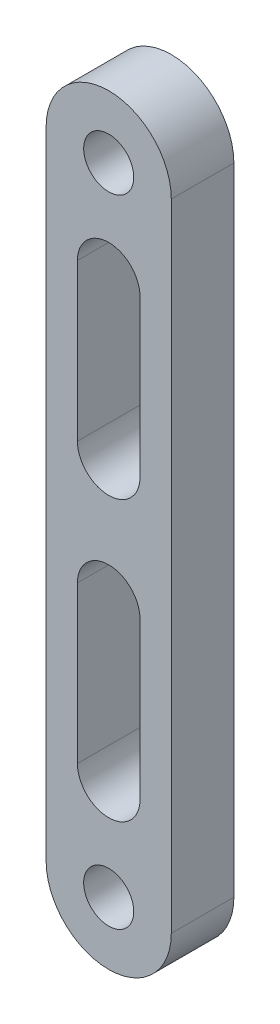
ISO-10303-21;
HEADER;
FILE_DESCRIPTION(('STEP AP214'),'2;1');
FILE_NAME('part.step','',(''),(''),'','','');
FILE_SCHEMA(('AUTOMOTIVE_DESIGN { 1 0 10303 214 1 1 1 1 }'));
ENDSEC;
DATA;
#1=APPLICATION_CONTEXT('core data for automotive mechanical design processes');
#2=APPLICATION_PROTOCOL_DEFINITION('international standard','automotive_design',2000,#1);
#3=PRODUCT_CONTEXT('',#1,'mechanical');
#4=PRODUCT('Part','Part','',(#3));
#5=PRODUCT_RELATED_PRODUCT_CATEGORY('part','',(#4));
#6=PRODUCT_DEFINITION_FORMATION('','',#4);
#7=PRODUCT_DEFINITION_CONTEXT('part definition',#1,'design');
#8=PRODUCT_DEFINITION('design','',#6,#7);
#9=PRODUCT_DEFINITION_SHAPE('','',#8);
#10=(LENGTH_UNIT() NAMED_UNIT(*) SI_UNIT(.MILLI.,.METRE.));
#11=(NAMED_UNIT(*) PLANE_ANGLE_UNIT() SI_UNIT($,.RADIAN.));
#12=(NAMED_UNIT(*) SI_UNIT($,.STERADIAN.) SOLID_ANGLE_UNIT());
#13=UNCERTAINTY_MEASURE_WITH_UNIT(LENGTH_MEASURE(1.E-05),#10,'distance_accuracy_value','');
#14=(GEOMETRIC_REPRESENTATION_CONTEXT(3) GLOBAL_UNCERTAINTY_ASSIGNED_CONTEXT((#13)) GLOBAL_UNIT_ASSIGNED_CONTEXT((#10,
#11,#12)) REPRESENTATION_CONTEXT('',''));
#15=CARTESIAN_POINT('',(0.,0.,0.));
#16=DIRECTION('',(0.,0.,1.));
#17=DIRECTION('',(1.,0.,0.));
#18=AXIS2_PLACEMENT_3D('',#15,#16,#17);
#19=CARTESIAN_POINT('',(0.,-50.8,10.));
#20=DIRECTION('',(0.,0.,1.));
#21=DIRECTION('',(1.,0.,0.));
#22=AXIS2_PLACEMENT_3D('',#19,#20,#21);
#23=PLANE('',#22);
#24=CARTESIAN_POINT('',(0.,-50.8,10.));
#25=DIRECTION('',(0.,0.,1.));
#26=DIRECTION('',(1.,0.,0.));
#27=AXIS2_PLACEMENT_3D('',#24,#25,#26);
#28=CIRCLE('',#27,4.);
#29=CARTESIAN_POINT('',(4.00000000000001,-50.8,10.));
#30=VERTEX_POINT('',#29);
#31=EDGE_CURVE('E228',#30,#30,#28,.T.);
#32=ORIENTED_EDGE('',*,*,#31,.F.);
#33=EDGE_LOOP('',(#32));
#34=FACE_BOUND('',#33,.T.);
#35=CARTESIAN_POINT('',(0.,-50.8,10.));
#36=DIRECTION('',(0.,0.,1.));
#37=DIRECTION('',(1.,0.,0.));
#38=AXIS2_PLACEMENT_3D('',#35,#36,#37);
#39=CIRCLE('',#38,10.);
#40=CARTESIAN_POINT('',(-9.99999999999999,-50.8,10.));
#41=VERTEX_POINT('',#40);
#42=CARTESIAN_POINT('',(10.,-50.8,10.));
#43=VERTEX_POINT('',#42);
#44=EDGE_CURVE('E236',#41,#43,#39,.T.);
#45=ORIENTED_EDGE('',*,*,#44,.T.);
#46=DIRECTION('',(0.,1.,0.));
#47=VECTOR('',#46,1.);
#48=CARTESIAN_POINT('',(10.,-50.8,10.));
#49=LINE('',#48,#47);
#50=CARTESIAN_POINT('',(10.,50.8,10.));
#51=VERTEX_POINT('',#50);
#52=EDGE_CURVE('E240',#43,#51,#49,.T.);
#53=ORIENTED_EDGE('',*,*,#52,.T.);
#54=CARTESIAN_POINT('',(0.,50.8,10.));
#55=DIRECTION('',(0.,0.,1.));
#56=DIRECTION('',(1.,0.,0.));
#57=AXIS2_PLACEMENT_3D('',#54,#55,#56);
#58=CIRCLE('',#57,10.);
#59=CARTESIAN_POINT('',(-10.,50.8,10.));
#60=VERTEX_POINT('',#59);
#61=EDGE_CURVE('E244',#51,#60,#58,.T.);
#62=ORIENTED_EDGE('',*,*,#61,.T.);
#63=DIRECTION('',(0.,-1.,0.));
#64=VECTOR('',#63,1.);
#65=CARTESIAN_POINT('',(-9.99999999999999,-50.8,10.));
#66=LINE('',#65,#64);
#67=EDGE_CURVE('E247',#60,#41,#66,.T.);
#68=ORIENTED_EDGE('',*,*,#67,.T.);
#69=EDGE_LOOP('',(#45,#53,#62,#68));
#70=FACE_BOUND('',#69,.T.);
#71=CARTESIAN_POINT('',(0.,50.8,10.));
#72=DIRECTION('',(0.,0.,1.));
#73=DIRECTION('',(1.,0.,0.));
#74=AXIS2_PLACEMENT_3D('',#71,#72,#73);
#75=CIRCLE('',#74,4.);
#76=CARTESIAN_POINT('',(4.,50.8,10.));
#77=VERTEX_POINT('',#76);
#78=EDGE_CURVE('E220',#77,#77,#75,.T.);
#79=ORIENTED_EDGE('',*,*,#78,.F.);
#80=EDGE_LOOP('',(#79));
#81=FACE_BOUND('',#80,.T.);
#82=DIRECTION('',(0.,1.,0.));
#83=VECTOR('',#82,1.);
#84=CARTESIAN_POINT('',(5.00000000000001,-34.8,10.));
#85=LINE('',#84,#83);
#86=CARTESIAN_POINT('',(5.00000000000001,-34.8,10.));
#87=VERTEX_POINT('',#86);
#88=CARTESIAN_POINT('',(4.99999999999999,-9.79999999999998,10.));
#89=VERTEX_POINT('',#88);
#90=EDGE_CURVE('E180',#87,#89,#85,.T.);
#91=ORIENTED_EDGE('',*,*,#90,.F.);
#92=CARTESIAN_POINT('',(0.,-34.8,10.));
#93=DIRECTION('',(0.,0.,1.));
#94=DIRECTION('',(1.,0.,0.));
#95=AXIS2_PLACEMENT_3D('',#92,#93,#94);
#96=CIRCLE('',#95,5.);
#97=CARTESIAN_POINT('',(-4.99999999999999,-34.8,10.));
#98=VERTEX_POINT('',#97);
#99=EDGE_CURVE('E177',#98,#87,#96,.T.);
#100=ORIENTED_EDGE('',*,*,#99,.F.);
#101=DIRECTION('',(0.,-1.,0.));
#102=VECTOR('',#101,1.);
#103=CARTESIAN_POINT('',(-4.99999999999999,-34.8,10.));
#104=LINE('',#103,#102);
#105=CARTESIAN_POINT('',(-4.99999999999999,-9.79999999999998,10.));
#106=VERTEX_POINT('',#105);
#107=EDGE_CURVE('E188',#106,#98,#104,.T.);
#108=ORIENTED_EDGE('',*,*,#107,.F.);
#109=CARTESIAN_POINT('',(0.,-9.79999999999997,10.));
#110=DIRECTION('',(0.,0.,1.));
#111=DIRECTION('',(1.,0.,0.));
#112=AXIS2_PLACEMENT_3D('',#109,#110,#111);
#113=CIRCLE('',#112,5.);
#114=EDGE_CURVE('E184',#89,#106,#113,.T.);
#115=ORIENTED_EDGE('',*,*,#114,.F.);
#116=EDGE_LOOP('',(#91,#100,#108,#115));
#117=FACE_BOUND('',#116,.T.);
#118=DIRECTION('',(0.,-1.,0.));
#119=VECTOR('',#118,1.);
#120=CARTESIAN_POINT('',(-5.,34.8,10.));
#121=LINE('',#120,#119);
#122=CARTESIAN_POINT('',(-5.,34.8,10.));
#123=VERTEX_POINT('',#122);
#124=CARTESIAN_POINT('',(-5.,9.8,10.));
#125=VERTEX_POINT('',#124);
#126=EDGE_CURVE('E138',#123,#125,#121,.T.);
#127=ORIENTED_EDGE('',*,*,#126,.F.);
#128=CARTESIAN_POINT('',(0.,34.8,10.));
#129=DIRECTION('',(0.,0.,1.));
#130=DIRECTION('',(1.,0.,0.));
#131=AXIS2_PLACEMENT_3D('',#128,#129,#130);
#132=CIRCLE('',#131,5.00000000000002);
#133=CARTESIAN_POINT('',(5.00000000000004,34.8,10.));
#134=VERTEX_POINT('',#133);
#135=EDGE_CURVE('E129',#134,#123,#132,.T.);
#136=ORIENTED_EDGE('',*,*,#135,.F.);
#137=DIRECTION('',(0.,1.,0.));
#138=VECTOR('',#137,1.);
#139=CARTESIAN_POINT('',(5.00000000000004,34.8,10.));
#140=LINE('',#139,#138);
#141=CARTESIAN_POINT('',(5.00000000000001,9.8,10.));
#142=VERTEX_POINT('',#141);
#143=EDGE_CURVE('E155',#142,#134,#140,.T.);
#144=ORIENTED_EDGE('',*,*,#143,.F.);
#145=CARTESIAN_POINT('',(0.,9.8,10.));
#146=DIRECTION('',(0.,0.,1.));
#147=DIRECTION('',(1.,0.,0.));
#148=AXIS2_PLACEMENT_3D('',#145,#146,#147);
#149=CIRCLE('',#148,5.00000000000001);
#150=EDGE_CURVE('E151',#125,#142,#149,.T.);
#151=ORIENTED_EDGE('',*,*,#150,.F.);
#152=EDGE_LOOP('',(#127,#136,#144,#151));
#153=FACE_BOUND('',#152,.T.);
#154=ADVANCED_FACE('F39',(#34,#70,#81,#117,#153),#23,.T.);
#155=CARTESIAN_POINT('',(0.,-50.8,0.));
#156=DIRECTION('',(0.,0.,1.));
#157=DIRECTION('',(1.,0.,0.));
#158=AXIS2_PLACEMENT_3D('',#155,#156,#157);
#159=PLANE('',#158);
#160=CARTESIAN_POINT('',(0.,-34.8,0.));
#161=DIRECTION('',(0.,0.,1.));
#162=DIRECTION('',(1.,0.,0.));
#163=AXIS2_PLACEMENT_3D('',#160,#161,#162);
#164=CIRCLE('',#163,5.);
#165=CARTESIAN_POINT('',(-4.99999999999999,-34.8,0.));
#166=VERTEX_POINT('',#165);
#167=CARTESIAN_POINT('',(5.00000000000001,-34.8,0.));
#168=VERTEX_POINT('',#167);
#169=EDGE_CURVE('E147',#166,#168,#164,.T.);
#170=ORIENTED_EDGE('',*,*,#169,.T.);
#171=DIRECTION('',(0.,1.,0.));
#172=VECTOR('',#171,1.);
#173=CARTESIAN_POINT('',(5.00000000000001,-34.8,0.));
#174=LINE('',#173,#172);
#175=CARTESIAN_POINT('',(4.99999999999999,-9.79999999999998,0.));
#176=VERTEX_POINT('',#175);
#177=EDGE_CURVE('E195',#168,#176,#174,.T.);
#178=ORIENTED_EDGE('',*,*,#177,.T.);
#179=CARTESIAN_POINT('',(0.,-9.79999999999997,0.));
#180=DIRECTION('',(0.,0.,1.));
#181=DIRECTION('',(1.,0.,0.));
#182=AXIS2_PLACEMENT_3D('',#179,#180,#181);
#183=CIRCLE('',#182,5.);
#184=CARTESIAN_POINT('',(-4.99999999999999,-9.79999999999998,0.));
#185=VERTEX_POINT('',#184);
#186=EDGE_CURVE('E199',#176,#185,#183,.T.);
#187=ORIENTED_EDGE('',*,*,#186,.T.);
#188=DIRECTION('',(0.,-1.,0.));
#189=VECTOR('',#188,1.);
#190=CARTESIAN_POINT('',(-4.99999999999999,-34.8,0.));
#191=LINE('',#190,#189);
#192=EDGE_CURVE('E181',#185,#166,#191,.T.);
#193=ORIENTED_EDGE('',*,*,#192,.T.);
#194=EDGE_LOOP('',(#170,#178,#187,#193));
#195=FACE_BOUND('',#194,.T.);
#196=CARTESIAN_POINT('',(0.,-50.8,0.));
#197=DIRECTION('',(0.,0.,1.));
#198=DIRECTION('',(1.,0.,0.));
#199=AXIS2_PLACEMENT_3D('',#196,#197,#198);
#200=CIRCLE('',#199,10.);
#201=CARTESIAN_POINT('',(-9.99999999999999,-50.8,0.));
#202=VERTEX_POINT('',#201);
#203=CARTESIAN_POINT('',(10.,-50.8,0.));
#204=VERTEX_POINT('',#203);
#205=EDGE_CURVE('E232',#202,#204,#200,.T.);
#206=ORIENTED_EDGE('',*,*,#205,.F.);
#207=DIRECTION('',(0.,-1.,0.));
#208=VECTOR('',#207,1.);
#209=CARTESIAN_POINT('',(-9.99999999999999,-50.8,0.));
#210=LINE('',#209,#208);
#211=CARTESIAN_POINT('',(-10.,50.8,0.));
#212=VERTEX_POINT('',#211);
#213=EDGE_CURVE('E241',#212,#202,#210,.T.);
#214=ORIENTED_EDGE('',*,*,#213,.F.);
#215=CARTESIAN_POINT('',(0.,50.8,0.));
#216=DIRECTION('',(0.,0.,1.));
#217=DIRECTION('',(1.,0.,0.));
#218=AXIS2_PLACEMENT_3D('',#215,#216,#217);
#219=CIRCLE('',#218,10.);
#220=CARTESIAN_POINT('',(10.,50.8,0.));
#221=VERTEX_POINT('',#220);
#222=EDGE_CURVE('E257',#221,#212,#219,.T.);
#223=ORIENTED_EDGE('',*,*,#222,.F.);
#224=DIRECTION('',(0.,1.,0.));
#225=VECTOR('',#224,1.);
#226=CARTESIAN_POINT('',(10.,-50.8,0.));
#227=LINE('',#226,#225);
#228=EDGE_CURVE('E254',#204,#221,#227,.T.);
#229=ORIENTED_EDGE('',*,*,#228,.F.);
#230=EDGE_LOOP('',(#206,#214,#223,#229));
#231=FACE_BOUND('',#230,.T.);
#232=CARTESIAN_POINT('',(0.,-50.8,0.));
#233=DIRECTION('',(0.,0.,1.));
#234=DIRECTION('',(1.,0.,0.));
#235=AXIS2_PLACEMENT_3D('',#232,#233,#234);
#236=CIRCLE('',#235,4.);
#237=CARTESIAN_POINT('',(4.00000000000001,-50.8,0.));
#238=VERTEX_POINT('',#237);
#239=EDGE_CURVE('E224',#238,#238,#236,.T.);
#240=ORIENTED_EDGE('',*,*,#239,.T.);
#241=EDGE_LOOP('',(#240));
#242=FACE_BOUND('',#241,.T.);
#243=CARTESIAN_POINT('',(0.,50.8,0.));
#244=DIRECTION('',(0.,0.,1.));
#245=DIRECTION('',(1.,0.,0.));
#246=AXIS2_PLACEMENT_3D('',#243,#244,#245);
#247=CIRCLE('',#246,4.);
#248=CARTESIAN_POINT('',(4.,50.8,0.));
#249=VERTEX_POINT('',#248);
#250=EDGE_CURVE('E219',#249,#249,#247,.T.);
#251=ORIENTED_EDGE('',*,*,#250,.T.);
#252=EDGE_LOOP('',(#251));
#253=FACE_BOUND('',#252,.T.);
#254=CARTESIAN_POINT('',(0.,34.8,0.));
#255=DIRECTION('',(0.,0.,1.));
#256=DIRECTION('',(1.,0.,0.));
#257=AXIS2_PLACEMENT_3D('',#254,#255,#256);
#258=CIRCLE('',#257,5.00000000000002);
#259=CARTESIAN_POINT('',(5.00000000000004,34.8,0.));
#260=VERTEX_POINT('',#259);
#261=CARTESIAN_POINT('',(-5.,34.8,0.));
#262=VERTEX_POINT('',#261);
#263=EDGE_CURVE('E63',#260,#262,#258,.T.);
#264=ORIENTED_EDGE('',*,*,#263,.T.);
#265=DIRECTION('',(0.,-1.,0.));
#266=VECTOR('',#265,1.);
#267=CARTESIAN_POINT('',(-5.,34.8,0.));
#268=LINE('',#267,#266);
#269=CARTESIAN_POINT('',(-5.,9.8,0.));
#270=VERTEX_POINT('',#269);
#271=EDGE_CURVE('E145',#262,#270,#268,.T.);
#272=ORIENTED_EDGE('',*,*,#271,.T.);
#273=CARTESIAN_POINT('',(0.,9.8,0.));
#274=DIRECTION('',(0.,0.,1.));
#275=DIRECTION('',(1.,0.,0.));
#276=AXIS2_PLACEMENT_3D('',#273,#274,#275);
#277=CIRCLE('',#276,5.00000000000001);
#278=CARTESIAN_POINT('',(5.00000000000001,9.8,0.));
#279=VERTEX_POINT('',#278);
#280=EDGE_CURVE('E164',#270,#279,#277,.T.);
#281=ORIENTED_EDGE('',*,*,#280,.T.);
#282=DIRECTION('',(0.,1.,0.));
#283=VECTOR('',#282,1.);
#284=CARTESIAN_POINT('',(5.00000000000004,34.8,0.));
#285=LINE('',#284,#283);
#286=EDGE_CURVE('E139',#279,#260,#285,.T.);
#287=ORIENTED_EDGE('',*,*,#286,.T.);
#288=EDGE_LOOP('',(#264,#272,#281,#287));
#289=FACE_BOUND('',#288,.T.);
#290=ADVANCED_FACE('F280',(#195,#231,#242,#253,#289),#159,.F.);
#291=CARTESIAN_POINT('',(0.,-50.8,10.));
#292=DIRECTION('',(0.,0.,-1.));
#293=DIRECTION('',(-1.,0.,0.));
#294=AXIS2_PLACEMENT_3D('',#291,#292,#293);
#295=CYLINDRICAL_SURFACE('',#294,10.);
#296=ORIENTED_EDGE('',*,*,#205,.T.);
#297=DIRECTION('',(0.,0.,-1.));
#298=VECTOR('',#297,1.);
#299=CARTESIAN_POINT('',(10.,-50.8,10.));
#300=LINE('',#299,#298);
#301=EDGE_CURVE('E11',#43,#204,#300,.T.);
#302=ORIENTED_EDGE('',*,*,#301,.F.);
#303=ORIENTED_EDGE('',*,*,#44,.F.);
#304=DIRECTION('',(0.,0.,-1.));
#305=VECTOR('',#304,1.);
#306=CARTESIAN_POINT('',(-9.99999999999999,-50.8,10.));
#307=LINE('',#306,#305);
#308=EDGE_CURVE('E250',#41,#202,#307,.T.);
#309=ORIENTED_EDGE('',*,*,#308,.T.);
#310=EDGE_LOOP('',(#296,#302,#303,#309));
#311=FACE_BOUND('',#310,.T.);
#312=ADVANCED_FACE('F41',(#311),#295,.T.);
#313=CARTESIAN_POINT('',(10.,-50.8,10.));
#314=DIRECTION('',(-1.,0.,0.));
#315=DIRECTION('',(0.,-1.,0.));
#316=AXIS2_PLACEMENT_3D('',#313,#314,#315);
#317=PLANE('',#316);
#318=ORIENTED_EDGE('',*,*,#228,.T.);
#319=DIRECTION('',(0.,0.,-1.));
#320=VECTOR('',#319,1.);
#321=CARTESIAN_POINT('',(10.,50.8,10.));
#322=LINE('',#321,#320);
#323=EDGE_CURVE('E48',#51,#221,#322,.T.);
#324=ORIENTED_EDGE('',*,*,#323,.F.);
#325=ORIENTED_EDGE('',*,*,#52,.F.);
#326=ORIENTED_EDGE('',*,*,#301,.T.);
#327=EDGE_LOOP('',(#318,#324,#325,#326));
#328=FACE_BOUND('',#327,.T.);
#329=ADVANCED_FACE('F291',(#328),#317,.F.);
#330=CARTESIAN_POINT('',(0.,50.8,10.));
#331=DIRECTION('',(0.,0.,-1.));
#332=DIRECTION('',(-1.,0.,0.));
#333=AXIS2_PLACEMENT_3D('',#330,#331,#332);
#334=CYLINDRICAL_SURFACE('',#333,10.);
#335=ORIENTED_EDGE('',*,*,#222,.T.);
#336=DIRECTION('',(0.,0.,-1.));
#337=VECTOR('',#336,1.);
#338=CARTESIAN_POINT('',(-10.,50.8,10.));
#339=LINE('',#338,#337);
#340=EDGE_CURVE('E265',#60,#212,#339,.T.);
#341=ORIENTED_EDGE('',*,*,#340,.F.);
#342=ORIENTED_EDGE('',*,*,#61,.F.);
#343=ORIENTED_EDGE('',*,*,#323,.T.);
#344=EDGE_LOOP('',(#335,#341,#342,#343));
#345=FACE_BOUND('',#344,.T.);
#346=ADVANCED_FACE('F274',(#345),#334,.T.);
#347=CARTESIAN_POINT('',(-9.99999999999999,-50.8,10.));
#348=DIRECTION('',(1.,0.,0.));
#349=DIRECTION('',(0.,1.,0.));
#350=AXIS2_PLACEMENT_3D('',#347,#348,#349);
#351=PLANE('',#350);
#352=ORIENTED_EDGE('',*,*,#213,.T.);
#353=ORIENTED_EDGE('',*,*,#308,.F.);
#354=ORIENTED_EDGE('',*,*,#67,.F.);
#355=ORIENTED_EDGE('',*,*,#340,.T.);
#356=EDGE_LOOP('',(#352,#353,#354,#355));
#357=FACE_BOUND('',#356,.T.);
#358=ADVANCED_FACE('F284',(#357),#351,.F.);
#359=CARTESIAN_POINT('',(0.,-50.8,10.));
#360=DIRECTION('',(0.,0.,-1.));
#361=DIRECTION('',(-1.,0.,0.));
#362=AXIS2_PLACEMENT_3D('',#359,#360,#361);
#363=CYLINDRICAL_SURFACE('',#362,4.);
#364=ORIENTED_EDGE('',*,*,#31,.T.);
#365=EDGE_LOOP('',(#364));
#366=FACE_BOUND('',#365,.T.);
#367=ORIENTED_EDGE('',*,*,#239,.F.);
#368=EDGE_LOOP('',(#367));
#369=FACE_BOUND('',#368,.T.);
#370=ADVANCED_FACE('F308',(#366,#369),#363,.F.);
#371=CARTESIAN_POINT('',(0.,50.8,10.));
#372=DIRECTION('',(0.,0.,-1.));
#373=DIRECTION('',(-1.,0.,0.));
#374=AXIS2_PLACEMENT_3D('',#371,#372,#373);
#375=CYLINDRICAL_SURFACE('',#374,4.);
#376=ORIENTED_EDGE('',*,*,#78,.T.);
#377=EDGE_LOOP('',(#376));
#378=FACE_BOUND('',#377,.T.);
#379=ORIENTED_EDGE('',*,*,#250,.F.);
#380=EDGE_LOOP('',(#379));
#381=FACE_BOUND('',#380,.T.);
#382=ADVANCED_FACE('F315',(#378,#381),#375,.F.);
#383=CARTESIAN_POINT('',(0.,-34.8,10.));
#384=DIRECTION('',(0.,0.,-1.));
#385=DIRECTION('',(-1.,0.,0.));
#386=AXIS2_PLACEMENT_3D('',#383,#384,#385);
#387=CYLINDRICAL_SURFACE('',#386,5.);
#388=ORIENTED_EDGE('',*,*,#169,.F.);
#389=DIRECTION('',(0.,0.,-1.));
#390=VECTOR('',#389,1.);
#391=CARTESIAN_POINT('',(-4.99999999999999,-34.8,10.));
#392=LINE('',#391,#390);
#393=EDGE_CURVE('E191',#98,#166,#392,.T.);
#394=ORIENTED_EDGE('',*,*,#393,.F.);
#395=ORIENTED_EDGE('',*,*,#99,.T.);
#396=DIRECTION('',(0.,0.,-1.));
#397=VECTOR('',#396,1.);
#398=CARTESIAN_POINT('',(5.00000000000001,-34.8,10.));
#399=LINE('',#398,#397);
#400=EDGE_CURVE('E215',#87,#168,#399,.T.);
#401=ORIENTED_EDGE('',*,*,#400,.T.);
#402=EDGE_LOOP('',(#388,#394,#395,#401));
#403=FACE_BOUND('',#402,.T.);
#404=ADVANCED_FACE('F320',(#403),#387,.F.);
#405=CARTESIAN_POINT('',(5.00000000000001,-34.8,10.));
#406=DIRECTION('',(-1.,0.,0.));
#407=DIRECTION('',(0.,0.,1.));
#408=AXIS2_PLACEMENT_3D('',#405,#406,#407);
#409=PLANE('',#408);
#410=ORIENTED_EDGE('',*,*,#177,.F.);
#411=ORIENTED_EDGE('',*,*,#400,.F.);
#412=ORIENTED_EDGE('',*,*,#90,.T.);
#413=DIRECTION('',(0.,0.,-1.));
#414=VECTOR('',#413,1.);
#415=CARTESIAN_POINT('',(4.99999999999999,-9.79999999999998,10.));
#416=LINE('',#415,#414);
#417=EDGE_CURVE('E212',#89,#176,#416,.T.);
#418=ORIENTED_EDGE('',*,*,#417,.T.);
#419=EDGE_LOOP('',(#410,#411,#412,#418));
#420=FACE_BOUND('',#419,.T.);
#421=ADVANCED_FACE('F349',(#420),#409,.T.);
#422=CARTESIAN_POINT('',(0.,-9.79999999999997,10.));
#423=DIRECTION('',(0.,0.,-1.));
#424=DIRECTION('',(-1.,0.,0.));
#425=AXIS2_PLACEMENT_3D('',#422,#423,#424);
#426=CYLINDRICAL_SURFACE('',#425,5.);
#427=ORIENTED_EDGE('',*,*,#186,.F.);
#428=ORIENTED_EDGE('',*,*,#417,.F.);
#429=ORIENTED_EDGE('',*,*,#114,.T.);
#430=DIRECTION('',(0.,0.,-1.));
#431=VECTOR('',#430,1.);
#432=CARTESIAN_POINT('',(-4.99999999999999,-9.79999999999998,10.));
#433=LINE('',#432,#431);
#434=EDGE_CURVE('E209',#106,#185,#433,.T.);
#435=ORIENTED_EDGE('',*,*,#434,.T.);
#436=EDGE_LOOP('',(#427,#428,#429,#435));
#437=FACE_BOUND('',#436,.T.);
#438=ADVANCED_FACE('F345',(#437),#426,.F.);
#439=CARTESIAN_POINT('',(-4.99999999999999,-34.8,10.));
#440=DIRECTION('',(1.,0.,0.));
#441=DIRECTION('',(0.,0.,-1.));
#442=AXIS2_PLACEMENT_3D('',#439,#440,#441);
#443=PLANE('',#442);
#444=ORIENTED_EDGE('',*,*,#192,.F.);
#445=ORIENTED_EDGE('',*,*,#434,.F.);
#446=ORIENTED_EDGE('',*,*,#107,.T.);
#447=ORIENTED_EDGE('',*,*,#393,.T.);
#448=EDGE_LOOP('',(#444,#445,#446,#447));
#449=FACE_BOUND('',#448,.T.);
#450=ADVANCED_FACE('F342',(#449),#443,.T.);
#451=CARTESIAN_POINT('',(0.,34.8,10.));
#452=DIRECTION('',(0.,0.,-1.));
#453=DIRECTION('',(-1.,0.,0.));
#454=AXIS2_PLACEMENT_3D('',#451,#452,#453);
#455=CYLINDRICAL_SURFACE('',#454,5.00000000000002);
#456=ORIENTED_EDGE('',*,*,#263,.F.);
#457=DIRECTION('',(0.,0.,-1.));
#458=VECTOR('',#457,1.);
#459=CARTESIAN_POINT('',(5.00000000000004,34.8,10.));
#460=LINE('',#459,#458);
#461=EDGE_CURVE('E133',#134,#260,#460,.T.);
#462=ORIENTED_EDGE('',*,*,#461,.F.);
#463=ORIENTED_EDGE('',*,*,#135,.T.);
#464=DIRECTION('',(0.,0.,-1.));
#465=VECTOR('',#464,1.);
#466=CARTESIAN_POINT('',(-5.,34.8,10.));
#467=LINE('',#466,#465);
#468=EDGE_CURVE('E132',#123,#262,#467,.T.);
#469=ORIENTED_EDGE('',*,*,#468,.T.);
#470=EDGE_LOOP('',(#456,#462,#463,#469));
#471=FACE_BOUND('',#470,.T.);
#472=ADVANCED_FACE('F131',(#471),#455,.F.);
#473=CARTESIAN_POINT('',(-5.,34.8,10.));
#474=DIRECTION('',(1.,0.,0.));
#475=DIRECTION('',(0.,1.,0.));
#476=AXIS2_PLACEMENT_3D('',#473,#474,#475);
#477=PLANE('',#476);
#478=ORIENTED_EDGE('',*,*,#271,.F.);
#479=ORIENTED_EDGE('',*,*,#468,.F.);
#480=ORIENTED_EDGE('',*,*,#126,.T.);
#481=DIRECTION('',(0.,0.,-1.));
#482=VECTOR('',#481,1.);
#483=CARTESIAN_POINT('',(-5.,9.8,10.));
#484=LINE('',#483,#482);
#485=EDGE_CURVE('E148',#125,#270,#484,.T.);
#486=ORIENTED_EDGE('',*,*,#485,.T.);
#487=EDGE_LOOP('',(#478,#479,#480,#486));
#488=FACE_BOUND('',#487,.T.);
#489=ADVANCED_FACE('F142',(#488),#477,.T.);
#490=CARTESIAN_POINT('',(0.,9.8,10.));
#491=DIRECTION('',(0.,0.,-1.));
#492=DIRECTION('',(-1.,0.,0.));
#493=AXIS2_PLACEMENT_3D('',#490,#491,#492);
#494=CYLINDRICAL_SURFACE('',#493,5.00000000000001);
#495=ORIENTED_EDGE('',*,*,#280,.F.);
#496=ORIENTED_EDGE('',*,*,#485,.F.);
#497=ORIENTED_EDGE('',*,*,#150,.T.);
#498=DIRECTION('',(0.,0.,-1.));
#499=VECTOR('',#498,1.);
#500=CARTESIAN_POINT('',(5.00000000000001,9.8,10.));
#501=LINE('',#500,#499);
#502=EDGE_CURVE('E55',#142,#279,#501,.T.);
#503=ORIENTED_EDGE('',*,*,#502,.T.);
#504=EDGE_LOOP('',(#495,#496,#497,#503));
#505=FACE_BOUND('',#504,.T.);
#506=ADVANCED_FACE('F330',(#505),#494,.F.);
#507=CARTESIAN_POINT('',(5.00000000000004,34.8,10.));
#508=DIRECTION('',(-1.,0.,0.));
#509=DIRECTION('',(0.,-1.,0.));
#510=AXIS2_PLACEMENT_3D('',#507,#508,#509);
#511=PLANE('',#510);
#512=ORIENTED_EDGE('',*,*,#286,.F.);
#513=ORIENTED_EDGE('',*,*,#502,.F.);
#514=ORIENTED_EDGE('',*,*,#143,.T.);
#515=ORIENTED_EDGE('',*,*,#461,.T.);
#516=EDGE_LOOP('',(#512,#513,#514,#515));
#517=FACE_BOUND('',#516,.T.);
#518=ADVANCED_FACE('F328',(#517),#511,.T.);
#519=CLOSED_SHELL('',(#154,#290,#312,#329,#346,#358,#370,#382,#404,#421,#438,#450,#472,#489,
#506,#518));
#520=MANIFOLD_SOLID_BREP('B2',#519);
#521=ADVANCED_BREP_SHAPE_REPRESENTATION('',(#18,#520),#14);
#522=SHAPE_DEFINITION_REPRESENTATION(#9,#521);
ENDSEC;
END-ISO-10303-21;
